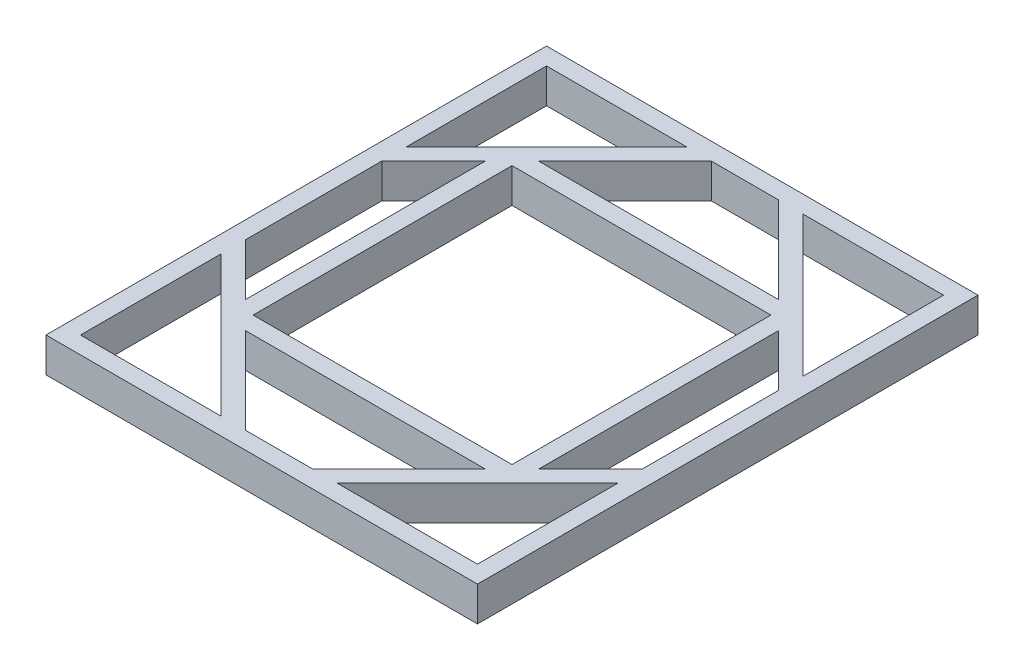
ISO-10303-21;
HEADER;
FILE_DESCRIPTION(('STEP AP214'),'2;1');
FILE_NAME('part.step','',(''),(''),'','','');
FILE_SCHEMA(('AUTOMOTIVE_DESIGN { 1 0 10303 214 1 1 1 1 }'));
ENDSEC;
DATA;
#1=APPLICATION_CONTEXT('core data for automotive mechanical design processes');
#2=APPLICATION_PROTOCOL_DEFINITION('international standard','automotive_design',2000,#1);
#3=PRODUCT_CONTEXT('',#1,'mechanical');
#4=PRODUCT('Part','Part','',(#3));
#5=PRODUCT_RELATED_PRODUCT_CATEGORY('part','',(#4));
#6=PRODUCT_DEFINITION_FORMATION('','',#4);
#7=PRODUCT_DEFINITION_CONTEXT('part definition',#1,'design');
#8=PRODUCT_DEFINITION('design','',#6,#7);
#9=PRODUCT_DEFINITION_SHAPE('','',#8);
#10=(LENGTH_UNIT() NAMED_UNIT(*) SI_UNIT(.MILLI.,.METRE.));
#11=(NAMED_UNIT(*) PLANE_ANGLE_UNIT() SI_UNIT($,.RADIAN.));
#12=(NAMED_UNIT(*) SI_UNIT($,.STERADIAN.) SOLID_ANGLE_UNIT());
#13=UNCERTAINTY_MEASURE_WITH_UNIT(LENGTH_MEASURE(1.E-05),#10,'distance_accuracy_value','');
#14=(GEOMETRIC_REPRESENTATION_CONTEXT(3) GLOBAL_UNCERTAINTY_ASSIGNED_CONTEXT((#13)) GLOBAL_UNIT_ASSIGNED_CONTEXT((#10,
#11,#12)) REPRESENTATION_CONTEXT('',''));
#15=CARTESIAN_POINT('',(0.,0.,0.));
#16=DIRECTION('',(0.,0.,1.));
#17=DIRECTION('',(1.,0.,0.));
#18=AXIS2_PLACEMENT_3D('',#15,#16,#17);
#19=CARTESIAN_POINT('',(0.,50.8,368.3));
#20=DIRECTION('',(0.,0.,-1.));
#21=DIRECTION('',(-1.,0.,0.));
#22=AXIS2_PLACEMENT_3D('',#19,#20,#21);
#23=PLANE('',#22);
#24=DIRECTION('',(1.,0.,0.));
#25=VECTOR('',#24,1.);
#26=CARTESIAN_POINT('',(0.,0.,368.3));
#27=LINE('',#26,#25);
#28=CARTESIAN_POINT('',(-317.5,0.,368.3));
#29=VERTEX_POINT('',#28);
#30=CARTESIAN_POINT('',(317.5,0.,368.3));
#31=VERTEX_POINT('',#30);
#32=EDGE_CURVE('E378',#29,#31,#27,.T.);
#33=ORIENTED_EDGE('',*,*,#32,.T.);
#34=DIRECTION('',(0.,-1.,0.));
#35=VECTOR('',#34,1.);
#36=CARTESIAN_POINT('',(317.5,50.8,368.3));
#37=LINE('',#36,#35);
#38=CARTESIAN_POINT('',(317.5,50.8,368.3));
#39=VERTEX_POINT('',#38);
#40=EDGE_CURVE('E11',#39,#31,#37,.T.);
#41=ORIENTED_EDGE('',*,*,#40,.F.);
#42=DIRECTION('',(1.,0.,0.));
#43=VECTOR('',#42,1.);
#44=CARTESIAN_POINT('',(0.,50.8,368.3));
#45=LINE('',#44,#43);
#46=CARTESIAN_POINT('',(-317.5,50.8,368.3));
#47=VERTEX_POINT('',#46);
#48=EDGE_CURVE('E290',#47,#39,#45,.T.);
#49=ORIENTED_EDGE('',*,*,#48,.F.);
#50=DIRECTION('',(0.,-1.,0.));
#51=VECTOR('',#50,1.);
#52=CARTESIAN_POINT('',(-317.5,50.8,368.3));
#53=LINE('',#52,#51);
#54=EDGE_CURVE('E61',#47,#29,#53,.T.);
#55=ORIENTED_EDGE('',*,*,#54,.T.);
#56=EDGE_LOOP('',(#33,#41,#49,#55));
#57=FACE_BOUND('',#56,.T.);
#58=ADVANCED_FACE('F42',(#57),#23,.F.);
#59=CARTESIAN_POINT('',(317.5,50.8,0.));
#60=DIRECTION('',(-1.,0.,0.));
#61=DIRECTION('',(0.,0.,1.));
#62=AXIS2_PLACEMENT_3D('',#59,#60,#61);
#63=PLANE('',#62);
#64=DIRECTION('',(0.,0.,-1.));
#65=VECTOR('',#64,1.);
#66=CARTESIAN_POINT('',(317.5,0.,0.));
#67=LINE('',#66,#65);
#68=CARTESIAN_POINT('',(317.5,0.,-368.3));
#69=VERTEX_POINT('',#68);
#70=EDGE_CURVE('E296',#31,#69,#67,.T.);
#71=ORIENTED_EDGE('',*,*,#70,.T.);
#72=DIRECTION('',(0.,-1.,0.));
#73=VECTOR('',#72,1.);
#74=CARTESIAN_POINT('',(317.5,50.8,-368.3));
#75=LINE('',#74,#73);
#76=CARTESIAN_POINT('',(317.5,50.8,-368.3));
#77=VERTEX_POINT('',#76);
#78=EDGE_CURVE('E52',#77,#69,#75,.T.);
#79=ORIENTED_EDGE('',*,*,#78,.F.);
#80=DIRECTION('',(0.,0.,-1.));
#81=VECTOR('',#80,1.);
#82=CARTESIAN_POINT('',(317.5,50.8,0.));
#83=LINE('',#82,#81);
#84=EDGE_CURVE('E284',#39,#77,#83,.T.);
#85=ORIENTED_EDGE('',*,*,#84,.F.);
#86=ORIENTED_EDGE('',*,*,#40,.T.);
#87=EDGE_LOOP('',(#71,#79,#85,#86));
#88=FACE_BOUND('',#87,.T.);
#89=ADVANCED_FACE('F295',(#88),#63,.F.);
#90=CARTESIAN_POINT('',(0.,50.8,-368.3));
#91=DIRECTION('',(0.,0.,-1.));
#92=DIRECTION('',(-1.,0.,0.));
#93=AXIS2_PLACEMENT_3D('',#90,#91,#92);
#94=PLANE('',#93);
#95=DIRECTION('',(1.,0.,0.));
#96=VECTOR('',#95,1.);
#97=CARTESIAN_POINT('',(0.,0.,-368.3));
#98=LINE('',#97,#96);
#99=CARTESIAN_POINT('',(-317.5,0.,-368.3));
#100=VERTEX_POINT('',#99);
#101=EDGE_CURVE('E381',#100,#69,#98,.T.);
#102=ORIENTED_EDGE('',*,*,#101,.F.);
#103=DIRECTION('',(0.,-1.,0.));
#104=VECTOR('',#103,1.);
#105=CARTESIAN_POINT('',(-317.5,50.8,-368.3));
#106=LINE('',#105,#104);
#107=CARTESIAN_POINT('',(-317.5,50.8,-368.3));
#108=VERTEX_POINT('',#107);
#109=EDGE_CURVE('E171',#108,#100,#106,.T.);
#110=ORIENTED_EDGE('',*,*,#109,.F.);
#111=DIRECTION('',(1.,0.,0.));
#112=VECTOR('',#111,1.);
#113=CARTESIAN_POINT('',(0.,50.8,-368.3));
#114=LINE('',#113,#112);
#115=EDGE_CURVE('E289',#108,#77,#114,.T.);
#116=ORIENTED_EDGE('',*,*,#115,.T.);
#117=ORIENTED_EDGE('',*,*,#78,.T.);
#118=EDGE_LOOP('',(#102,#110,#116,#117));
#119=FACE_BOUND('',#118,.T.);
#120=ADVANCED_FACE('F300',(#119),#94,.T.);
#121=CARTESIAN_POINT('',(-292.1,50.8,0.));
#122=DIRECTION('',(-1.,0.,0.));
#123=DIRECTION('',(0.,0.,1.));
#124=AXIS2_PLACEMENT_3D('',#121,#122,#123);
#125=PLANE('',#124);
#126=DIRECTION('',(0.,0.,-1.));
#127=VECTOR('',#126,1.);
#128=CARTESIAN_POINT('',(-292.1,0.,0.));
#129=LINE('',#128,#127);
#130=CARTESIAN_POINT('',(-292.1,0.,342.9));
#131=VERTEX_POINT('',#130);
#132=CARTESIAN_POINT('',(-292.1,0.,136.35410921541));
#133=VERTEX_POINT('',#132);
#134=EDGE_CURVE('E364',#131,#133,#129,.T.);
#135=ORIENTED_EDGE('',*,*,#134,.T.);
#136=DIRECTION('',(0.,-1.,0.));
#137=VECTOR('',#136,1.);
#138=CARTESIAN_POINT('',(-292.1,50.8,136.35410921541));
#139=LINE('',#138,#137);
#140=CARTESIAN_POINT('',(-292.1,50.8,136.35410921541));
#141=VERTEX_POINT('',#140);
#142=EDGE_CURVE('E388',#141,#133,#139,.T.);
#143=ORIENTED_EDGE('',*,*,#142,.F.);
#144=DIRECTION('',(0.,0.,-1.));
#145=VECTOR('',#144,1.);
#146=CARTESIAN_POINT('',(-292.1,50.8,0.));
#147=LINE('',#146,#145);
#148=CARTESIAN_POINT('',(-292.1,50.8,342.9));
#149=VERTEX_POINT('',#148);
#150=EDGE_CURVE('E663',#149,#141,#147,.T.);
#151=ORIENTED_EDGE('',*,*,#150,.F.);
#152=DIRECTION('',(0.,-1.,0.));
#153=VECTOR('',#152,1.);
#154=CARTESIAN_POINT('',(-292.1,50.8,342.9));
#155=LINE('',#154,#153);
#156=EDGE_CURVE('E390',#149,#131,#155,.T.);
#157=ORIENTED_EDGE('',*,*,#156,.T.);
#158=EDGE_LOOP('',(#135,#143,#151,#157));
#159=FACE_BOUND('',#158,.T.);
#160=ADVANCED_FACE('F499',(#159),#125,.F.);
#161=CARTESIAN_POINT('',(-214.227054607704,50.8,214.227054607705));
#162=DIRECTION('',(0.707106781186546,0.,-0.707106781186549));
#163=DIRECTION('',(-0.707106781186549,0.,-0.707106781186546));
#164=AXIS2_PLACEMENT_3D('',#161,#162,#163);
#165=PLANE('',#164);
#166=DIRECTION('',(0.707106781186549,0.,0.707106781186546));
#167=VECTOR('',#166,1.);
#168=CARTESIAN_POINT('',(-214.227054607704,0.,214.227054607705));
#169=LINE('',#168,#167);
#170=CARTESIAN_POINT('',(-85.5541092154091,0.,342.9));
#171=VERTEX_POINT('',#170);
#172=EDGE_CURVE('E375',#133,#171,#169,.T.);
#173=ORIENTED_EDGE('',*,*,#172,.T.);
#174=DIRECTION('',(0.,-1.,0.));
#175=VECTOR('',#174,1.);
#176=CARTESIAN_POINT('',(-85.5541092154091,50.8,342.9));
#177=LINE('',#176,#175);
#178=CARTESIAN_POINT('',(-85.5541092154091,50.8,342.9));
#179=VERTEX_POINT('',#178);
#180=EDGE_CURVE('E392',#179,#171,#177,.T.);
#181=ORIENTED_EDGE('',*,*,#180,.F.);
#182=DIRECTION('',(0.707106781186549,0.,0.707106781186546));
#183=VECTOR('',#182,1.);
#184=CARTESIAN_POINT('',(-214.227054607704,50.8,214.227054607705));
#185=LINE('',#184,#183);
#186=EDGE_CURVE('E674',#141,#179,#185,.T.);
#187=ORIENTED_EDGE('',*,*,#186,.F.);
#188=ORIENTED_EDGE('',*,*,#142,.T.);
#189=EDGE_LOOP('',(#173,#181,#187,#188));
#190=FACE_BOUND('',#189,.T.);
#191=ADVANCED_FACE('F495',(#190),#165,.F.);
#192=CARTESIAN_POINT('',(-292.1,0.,100.433084731133));
#193=VERTEX_POINT('',#192);
#194=CARTESIAN_POINT('',(-292.1,0.,-100.433084731133));
#195=VERTEX_POINT('',#194);
#196=EDGE_CURVE('E365',#193,#195,#129,.T.);
#197=ORIENTED_EDGE('',*,*,#196,.T.);
#198=DIRECTION('',(0.,-1.,0.));
#199=VECTOR('',#198,1.);
#200=CARTESIAN_POINT('',(-292.1,50.8,-100.433084731133));
#201=LINE('',#200,#199);
#202=CARTESIAN_POINT('',(-292.1,50.8,-100.433084731133));
#203=VERTEX_POINT('',#202);
#204=EDGE_CURVE('E393',#203,#195,#201,.T.);
#205=ORIENTED_EDGE('',*,*,#204,.F.);
#206=CARTESIAN_POINT('',(-292.1,50.8,100.433084731133));
#207=VERTEX_POINT('',#206);
#208=EDGE_CURVE('E664',#207,#203,#147,.T.);
#209=ORIENTED_EDGE('',*,*,#208,.F.);
#210=DIRECTION('',(0.,-1.,0.));
#211=VECTOR('',#210,1.);
#212=CARTESIAN_POINT('',(-292.1,50.8,100.433084731133));
#213=LINE('',#212,#211);
#214=EDGE_CURVE('E397',#207,#193,#213,.T.);
#215=ORIENTED_EDGE('',*,*,#214,.T.);
#216=EDGE_LOOP('',(#197,#205,#209,#215));
#217=FACE_BOUND('',#216,.T.);
#218=ADVANCED_FACE('F498',(#217),#125,.F.);
#219=CARTESIAN_POINT('',(-196.266542365566,50.8,-196.266542365567));
#220=DIRECTION('',(-0.707106781186546,0.,-0.707106781186549));
#221=DIRECTION('',(-0.707106781186549,0.,0.707106781186546));
#222=AXIS2_PLACEMENT_3D('',#219,#220,#221);
#223=PLANE('',#222);
#224=DIRECTION('',(0.707106781186549,0.,-0.707106781186546));
#225=VECTOR('',#224,1.);
#226=CARTESIAN_POINT('',(-196.266542365566,0.,-196.266542365567));
#227=LINE('',#226,#225);
#228=CARTESIAN_POINT('',(-215.9,0.,-176.633084731133));
#229=VERTEX_POINT('',#228);
#230=EDGE_CURVE('E330',#195,#229,#227,.T.);
#231=ORIENTED_EDGE('',*,*,#230,.T.);
#232=DIRECTION('',(0.,-1.,0.));
#233=VECTOR('',#232,1.);
#234=CARTESIAN_POINT('',(-215.9,50.8,-176.633084731133));
#235=LINE('',#234,#233);
#236=CARTESIAN_POINT('',(-215.9,50.8,-176.633084731133));
#237=VERTEX_POINT('',#236);
#238=EDGE_CURVE('E402',#237,#229,#235,.T.);
#239=ORIENTED_EDGE('',*,*,#238,.F.);
#240=DIRECTION('',(0.707106781186549,0.,-0.707106781186546));
#241=VECTOR('',#240,1.);
#242=CARTESIAN_POINT('',(-196.266542365566,50.8,-196.266542365567));
#243=LINE('',#242,#241);
#244=EDGE_CURVE('E673',#203,#237,#243,.T.);
#245=ORIENTED_EDGE('',*,*,#244,.F.);
#246=ORIENTED_EDGE('',*,*,#204,.T.);
#247=EDGE_LOOP('',(#231,#239,#245,#246));
#248=FACE_BOUND('',#247,.T.);
#249=ADVANCED_FACE('F514',(#248),#223,.F.);
#250=CARTESIAN_POINT('',(-215.9,50.8,0.));
#251=DIRECTION('',(1.,0.,0.));
#252=DIRECTION('',(0.,0.,-1.));
#253=AXIS2_PLACEMENT_3D('',#250,#251,#252);
#254=PLANE('',#253);
#255=DIRECTION('',(0.,0.,1.));
#256=VECTOR('',#255,1.);
#257=CARTESIAN_POINT('',(-215.9,0.,0.));
#258=LINE('',#257,#256);
#259=CARTESIAN_POINT('',(-215.9,0.,176.633084731133));
#260=VERTEX_POINT('',#259);
#261=EDGE_CURVE('E372',#229,#260,#258,.T.);
#262=ORIENTED_EDGE('',*,*,#261,.T.);
#263=DIRECTION('',(0.,-1.,0.));
#264=VECTOR('',#263,1.);
#265=CARTESIAN_POINT('',(-215.9,50.8,176.633084731133));
#266=LINE('',#265,#264);
#267=CARTESIAN_POINT('',(-215.9,50.8,176.633084731133));
#268=VERTEX_POINT('',#267);
#269=EDGE_CURVE('E399',#268,#260,#266,.T.);
#270=ORIENTED_EDGE('',*,*,#269,.F.);
#271=DIRECTION('',(0.,0.,1.));
#272=VECTOR('',#271,1.);
#273=CARTESIAN_POINT('',(-215.9,50.8,0.));
#274=LINE('',#273,#272);
#275=EDGE_CURVE('E671',#237,#268,#274,.T.);
#276=ORIENTED_EDGE('',*,*,#275,.F.);
#277=ORIENTED_EDGE('',*,*,#238,.T.);
#278=EDGE_LOOP('',(#262,#270,#276,#277));
#279=FACE_BOUND('',#278,.T.);
#280=ADVANCED_FACE('F510',(#279),#254,.F.);
#281=CARTESIAN_POINT('',(196.266542365566,50.8,196.266542365567));
#282=DIRECTION('',(0.707106781186546,0.,0.707106781186549));
#283=DIRECTION('',(0.707106781186549,0.,-0.707106781186546));
#284=AXIS2_PLACEMENT_3D('',#281,#282,#283);
#285=PLANE('',#284);
#286=DIRECTION('',(-0.707106781186549,0.,0.707106781186546));
#287=VECTOR('',#286,1.);
#288=CARTESIAN_POINT('',(196.266542365566,0.,196.266542365567));
#289=LINE('',#288,#287);
#290=CARTESIAN_POINT('',(176.656999999999,0.,215.876084731133));
#291=VERTEX_POINT('',#290);
#292=CARTESIAN_POINT('',(49.6330847311324,0.,342.9));
#293=VERTEX_POINT('',#292);
#294=EDGE_CURVE('E346',#291,#293,#289,.T.);
#295=ORIENTED_EDGE('',*,*,#294,.T.);
#296=DIRECTION('',(0.,-1.,0.));
#297=VECTOR('',#296,1.);
#298=CARTESIAN_POINT('',(49.6330847311324,50.8,342.9));
#299=LINE('',#298,#297);
#300=CARTESIAN_POINT('',(49.6330847311324,50.8,342.9));
#301=VERTEX_POINT('',#300);
#302=EDGE_CURVE('E400',#301,#293,#299,.T.);
#303=ORIENTED_EDGE('',*,*,#302,.F.);
#304=DIRECTION('',(-0.707106781186549,0.,0.707106781186546));
#305=VECTOR('',#304,1.);
#306=CARTESIAN_POINT('',(196.266542365566,50.8,196.266542365567));
#307=LINE('',#306,#305);
#308=CARTESIAN_POINT('',(176.656999999999,50.8,215.876084731133));
#309=VERTEX_POINT('',#308);
#310=EDGE_CURVE('E626',#309,#301,#307,.T.);
#311=ORIENTED_EDGE('',*,*,#310,.F.);
#312=DIRECTION('',(0.,-1.,0.));
#313=VECTOR('',#312,1.);
#314=CARTESIAN_POINT('',(176.656999999999,50.8,215.876084731133));
#315=LINE('',#314,#313);
#316=EDGE_CURVE('E407',#309,#291,#315,.T.);
#317=ORIENTED_EDGE('',*,*,#316,.T.);
#318=EDGE_LOOP('',(#295,#303,#311,#317));
#319=FACE_BOUND('',#318,.T.);
#320=ADVANCED_FACE('F513',(#319),#285,.F.);
#321=CARTESIAN_POINT('',(0.,50.8,342.9));
#322=DIRECTION('',(0.,0.,-1.));
#323=DIRECTION('',(-1.,0.,0.));
#324=AXIS2_PLACEMENT_3D('',#321,#322,#323);
#325=PLANE('',#324);
#326=DIRECTION('',(1.,0.,0.));
#327=VECTOR('',#326,1.);
#328=CARTESIAN_POINT('',(0.,0.,342.9));
#329=LINE('',#328,#327);
#330=CARTESIAN_POINT('',(-49.6330847311324,0.,342.9));
#331=VERTEX_POINT('',#330);
#332=EDGE_CURVE('E355',#331,#293,#329,.T.);
#333=ORIENTED_EDGE('',*,*,#332,.F.);
#334=DIRECTION('',(0.,-1.,0.));
#335=VECTOR('',#334,1.);
#336=CARTESIAN_POINT('',(-49.6330847311324,50.8,342.9));
#337=LINE('',#336,#335);
#338=CARTESIAN_POINT('',(-49.6330847311324,50.8,342.9));
#339=VERTEX_POINT('',#338);
#340=EDGE_CURVE('E413',#339,#331,#337,.T.);
#341=ORIENTED_EDGE('',*,*,#340,.F.);
#342=DIRECTION('',(1.,0.,0.));
#343=VECTOR('',#342,1.);
#344=CARTESIAN_POINT('',(0.,50.8,342.9));
#345=LINE('',#344,#343);
#346=EDGE_CURVE('E608',#339,#301,#345,.T.);
#347=ORIENTED_EDGE('',*,*,#346,.T.);
#348=ORIENTED_EDGE('',*,*,#302,.T.);
#349=EDGE_LOOP('',(#333,#341,#347,#348));
#350=FACE_BOUND('',#349,.T.);
#351=ADVANCED_FACE('F485',(#350),#325,.T.);
#352=CARTESIAN_POINT('',(-196.266542365566,50.8,196.266542365567));
#353=DIRECTION('',(0.707106781186546,0.,-0.707106781186549));
#354=DIRECTION('',(-0.707106781186549,0.,-0.707106781186546));
#355=AXIS2_PLACEMENT_3D('',#352,#353,#354);
#356=PLANE('',#355);
#357=DIRECTION('',(0.707106781186549,0.,0.707106781186546));
#358=VECTOR('',#357,1.);
#359=CARTESIAN_POINT('',(-196.266542365566,0.,196.266542365567));
#360=LINE('',#359,#358);
#361=CARTESIAN_POINT('',(-176.656999999999,0.,215.876084731133));
#362=VERTEX_POINT('',#361);
#363=EDGE_CURVE('E366',#362,#331,#360,.T.);
#364=ORIENTED_EDGE('',*,*,#363,.F.);
#365=DIRECTION('',(0.,-1.,0.));
#366=VECTOR('',#365,1.);
#367=CARTESIAN_POINT('',(-176.656999999999,50.8,215.876084731133));
#368=LINE('',#367,#366);
#369=CARTESIAN_POINT('',(-176.656999999999,50.8,215.876084731133));
#370=VERTEX_POINT('',#369);
#371=EDGE_CURVE('E410',#370,#362,#368,.T.);
#372=ORIENTED_EDGE('',*,*,#371,.F.);
#373=DIRECTION('',(0.707106781186549,0.,0.707106781186546));
#374=VECTOR('',#373,1.);
#375=CARTESIAN_POINT('',(-196.266542365566,50.8,196.266542365567));
#376=LINE('',#375,#374);
#377=EDGE_CURVE('E665',#370,#339,#376,.T.);
#378=ORIENTED_EDGE('',*,*,#377,.T.);
#379=ORIENTED_EDGE('',*,*,#340,.T.);
#380=EDGE_LOOP('',(#364,#372,#378,#379));
#381=FACE_BOUND('',#380,.T.);
#382=ADVANCED_FACE('F509',(#381),#356,.T.);
#383=CARTESIAN_POINT('',(-214.227054607704,50.8,-214.227054607705));
#384=DIRECTION('',(-0.707106781186546,0.,-0.707106781186549));
#385=DIRECTION('',(-0.707106781186549,0.,0.707106781186546));
#386=AXIS2_PLACEMENT_3D('',#383,#384,#385);
#387=PLANE('',#386);
#388=DIRECTION('',(0.707106781186549,0.,-0.707106781186546));
#389=VECTOR('',#388,1.);
#390=CARTESIAN_POINT('',(-214.227054607704,0.,-214.227054607705));
#391=LINE('',#390,#389);
#392=CARTESIAN_POINT('',(-292.1,0.,-136.35410921541));
#393=VERTEX_POINT('',#392);
#394=CARTESIAN_POINT('',(-85.5541092154092,0.,-342.9));
#395=VERTEX_POINT('',#394);
#396=EDGE_CURVE('E358',#393,#395,#391,.T.);
#397=ORIENTED_EDGE('',*,*,#396,.F.);
#398=DIRECTION('',(0.,-1.,0.));
#399=VECTOR('',#398,1.);
#400=CARTESIAN_POINT('',(-292.1,50.8,-136.35410921541));
#401=LINE('',#400,#399);
#402=CARTESIAN_POINT('',(-292.1,50.8,-136.35410921541));
#403=VERTEX_POINT('',#402);
#404=EDGE_CURVE('E411',#403,#393,#401,.T.);
#405=ORIENTED_EDGE('',*,*,#404,.F.);
#406=DIRECTION('',(0.707106781186549,0.,-0.707106781186546));
#407=VECTOR('',#406,1.);
#408=CARTESIAN_POINT('',(-214.227054607704,50.8,-214.227054607705));
#409=LINE('',#408,#407);
#410=CARTESIAN_POINT('',(-85.5541092154092,50.8,-342.9));
#411=VERTEX_POINT('',#410);
#412=EDGE_CURVE('E610',#403,#411,#409,.T.);
#413=ORIENTED_EDGE('',*,*,#412,.T.);
#414=DIRECTION('',(0.,-1.,0.));
#415=VECTOR('',#414,1.);
#416=CARTESIAN_POINT('',(-85.5541092154092,50.8,-342.9));
#417=LINE('',#416,#415);
#418=EDGE_CURVE('E416',#411,#395,#417,.T.);
#419=ORIENTED_EDGE('',*,*,#418,.T.);
#420=EDGE_LOOP('',(#397,#405,#413,#419));
#421=FACE_BOUND('',#420,.T.);
#422=ADVANCED_FACE('F534',(#421),#387,.T.);
#423=CARTESIAN_POINT('',(-292.1,0.,-342.9));
#424=VERTEX_POINT('',#423);
#425=EDGE_CURVE('E361',#393,#424,#129,.T.);
#426=ORIENTED_EDGE('',*,*,#425,.T.);
#427=DIRECTION('',(0.,-1.,0.));
#428=VECTOR('',#427,1.);
#429=CARTESIAN_POINT('',(-292.1,50.8,-342.9));
#430=LINE('',#429,#428);
#431=CARTESIAN_POINT('',(-292.1,50.8,-342.9));
#432=VERTEX_POINT('',#431);
#433=EDGE_CURVE('E418',#432,#424,#430,.T.);
#434=ORIENTED_EDGE('',*,*,#433,.F.);
#435=EDGE_CURVE('E615',#403,#432,#147,.T.);
#436=ORIENTED_EDGE('',*,*,#435,.F.);
#437=ORIENTED_EDGE('',*,*,#404,.T.);
#438=EDGE_LOOP('',(#426,#434,#436,#437));
#439=FACE_BOUND('',#438,.T.);
#440=ADVANCED_FACE('F504',(#439),#125,.F.);
#441=CARTESIAN_POINT('',(85.5541092154091,0.,342.9));
#442=VERTEX_POINT('',#441);
#443=CARTESIAN_POINT('',(292.1,0.,342.9));
#444=VERTEX_POINT('',#443);
#445=EDGE_CURVE('E350',#442,#444,#329,.T.);
#446=ORIENTED_EDGE('',*,*,#445,.F.);
#447=DIRECTION('',(0.,-1.,0.));
#448=VECTOR('',#447,1.);
#449=CARTESIAN_POINT('',(85.5541092154091,50.8,342.9));
#450=LINE('',#449,#448);
#451=CARTESIAN_POINT('',(85.5541092154091,50.8,342.9));
#452=VERTEX_POINT('',#451);
#453=EDGE_CURVE('E419',#452,#442,#450,.T.);
#454=ORIENTED_EDGE('',*,*,#453,.F.);
#455=CARTESIAN_POINT('',(292.1,50.8,342.9));
#456=VERTEX_POINT('',#455);
#457=EDGE_CURVE('E603',#452,#456,#345,.T.);
#458=ORIENTED_EDGE('',*,*,#457,.T.);
#459=DIRECTION('',(0.,-1.,0.));
#460=VECTOR('',#459,1.);
#461=CARTESIAN_POINT('',(292.1,50.8,342.9));
#462=LINE('',#461,#460);
#463=EDGE_CURVE('E423',#456,#444,#462,.T.);
#464=ORIENTED_EDGE('',*,*,#463,.T.);
#465=EDGE_LOOP('',(#446,#454,#458,#464));
#466=FACE_BOUND('',#465,.T.);
#467=ADVANCED_FACE('F484',(#466),#325,.T.);
#468=CARTESIAN_POINT('',(214.227054607704,50.8,214.227054607705));
#469=DIRECTION('',(0.707106781186546,0.,0.707106781186549));
#470=DIRECTION('',(0.707106781186549,0.,-0.707106781186546));
#471=AXIS2_PLACEMENT_3D('',#468,#469,#470);
#472=PLANE('',#471);
#473=DIRECTION('',(-0.707106781186549,0.,0.707106781186546));
#474=VECTOR('',#473,1.);
#475=CARTESIAN_POINT('',(214.227054607704,0.,214.227054607705));
#476=LINE('',#475,#474);
#477=CARTESIAN_POINT('',(292.1,0.,136.35410921541));
#478=VERTEX_POINT('',#477);
#479=EDGE_CURVE('E353',#478,#442,#476,.T.);
#480=ORIENTED_EDGE('',*,*,#479,.F.);
#481=DIRECTION('',(0.,-1.,0.));
#482=VECTOR('',#481,1.);
#483=CARTESIAN_POINT('',(292.1,50.8,136.35410921541));
#484=LINE('',#483,#482);
#485=CARTESIAN_POINT('',(292.1,50.8,136.35410921541));
#486=VERTEX_POINT('',#485);
#487=EDGE_CURVE('E425',#486,#478,#484,.T.);
#488=ORIENTED_EDGE('',*,*,#487,.F.);
#489=DIRECTION('',(-0.707106781186549,0.,0.707106781186546));
#490=VECTOR('',#489,1.);
#491=CARTESIAN_POINT('',(214.227054607704,50.8,214.227054607705));
#492=LINE('',#491,#490);
#493=EDGE_CURVE('E600',#486,#452,#492,.T.);
#494=ORIENTED_EDGE('',*,*,#493,.T.);
#495=ORIENTED_EDGE('',*,*,#453,.T.);
#496=EDGE_LOOP('',(#480,#488,#494,#495));
#497=FACE_BOUND('',#496,.T.);
#498=ADVANCED_FACE('F543',(#497),#472,.T.);
#499=CARTESIAN_POINT('',(292.1,50.8,0.));
#500=DIRECTION('',(-1.,0.,0.));
#501=DIRECTION('',(0.,0.,1.));
#502=AXIS2_PLACEMENT_3D('',#499,#500,#501);
#503=PLANE('',#502);
#504=DIRECTION('',(0.,0.,-1.));
#505=VECTOR('',#504,1.);
#506=CARTESIAN_POINT('',(292.1,0.,0.));
#507=LINE('',#506,#505);
#508=CARTESIAN_POINT('',(292.1,0.,-136.35410921541));
#509=VERTEX_POINT('',#508);
#510=CARTESIAN_POINT('',(292.1,0.,-342.9));
#511=VERTEX_POINT('',#510);
#512=EDGE_CURVE('E343',#509,#511,#507,.T.);
#513=ORIENTED_EDGE('',*,*,#512,.F.);
#514=DIRECTION('',(0.,-1.,0.));
#515=VECTOR('',#514,1.);
#516=CARTESIAN_POINT('',(292.1,50.8,-136.35410921541));
#517=LINE('',#516,#515);
#518=CARTESIAN_POINT('',(292.1,50.8,-136.35410921541));
#519=VERTEX_POINT('',#518);
#520=EDGE_CURVE('E426',#519,#509,#517,.T.);
#521=ORIENTED_EDGE('',*,*,#520,.F.);
#522=DIRECTION('',(0.,0.,-1.));
#523=VECTOR('',#522,1.);
#524=CARTESIAN_POINT('',(292.1,50.8,0.));
#525=LINE('',#524,#523);
#526=CARTESIAN_POINT('',(292.1,50.8,-342.9));
#527=VERTEX_POINT('',#526);
#528=EDGE_CURVE('E612',#519,#527,#525,.T.);
#529=ORIENTED_EDGE('',*,*,#528,.T.);
#530=DIRECTION('',(0.,-1.,0.));
#531=VECTOR('',#530,1.);
#532=CARTESIAN_POINT('',(292.1,50.8,-342.9));
#533=LINE('',#532,#531);
#534=EDGE_CURVE('E429',#527,#511,#533,.T.);
#535=ORIENTED_EDGE('',*,*,#534,.T.);
#536=EDGE_LOOP('',(#513,#521,#529,#535));
#537=FACE_BOUND('',#536,.T.);
#538=ADVANCED_FACE('F542',(#537),#503,.T.);
#539=CARTESIAN_POINT('',(214.227054607704,50.8,-214.227054607705));
#540=DIRECTION('',(-0.707106781186546,0.,0.707106781186549));
#541=DIRECTION('',(0.707106781186549,0.,0.707106781186546));
#542=AXIS2_PLACEMENT_3D('',#539,#540,#541);
#543=PLANE('',#542);
#544=DIRECTION('',(-0.707106781186549,0.,-0.707106781186546));
#545=VECTOR('',#544,1.);
#546=CARTESIAN_POINT('',(214.227054607704,0.,-214.227054607705));
#547=LINE('',#546,#545);
#548=CARTESIAN_POINT('',(85.5541092154093,0.,-342.9));
#549=VERTEX_POINT('',#548);
#550=EDGE_CURVE('E347',#509,#549,#547,.T.);
#551=ORIENTED_EDGE('',*,*,#550,.T.);
#552=DIRECTION('',(0.,-1.,0.));
#553=VECTOR('',#552,1.);
#554=CARTESIAN_POINT('',(85.5541092154093,50.8,-342.9));
#555=LINE('',#554,#553);
#556=CARTESIAN_POINT('',(85.5541092154093,50.8,-342.9));
#557=VERTEX_POINT('',#556);
#558=EDGE_CURVE('E431',#557,#549,#555,.T.);
#559=ORIENTED_EDGE('',*,*,#558,.F.);
#560=DIRECTION('',(-0.707106781186549,0.,-0.707106781186546));
#561=VECTOR('',#560,1.);
#562=CARTESIAN_POINT('',(214.227054607704,50.8,-214.227054607705));
#563=LINE('',#562,#561);
#564=EDGE_CURVE('E620',#519,#557,#563,.T.);
#565=ORIENTED_EDGE('',*,*,#564,.F.);
#566=ORIENTED_EDGE('',*,*,#520,.T.);
#567=EDGE_LOOP('',(#551,#559,#565,#566));
#568=FACE_BOUND('',#567,.T.);
#569=ADVANCED_FACE('F547',(#568),#543,.F.);
#570=CARTESIAN_POINT('',(215.9,50.8,0.));
#571=DIRECTION('',(1.,0.,0.));
#572=DIRECTION('',(0.,0.,-1.));
#573=AXIS2_PLACEMENT_3D('',#570,#571,#572);
#574=PLANE('',#573);
#575=DIRECTION('',(0.,0.,1.));
#576=VECTOR('',#575,1.);
#577=CARTESIAN_POINT('',(215.9,0.,0.));
#578=LINE('',#577,#576);
#579=CARTESIAN_POINT('',(215.9,0.,-176.633084731133));
#580=VERTEX_POINT('',#579);
#581=CARTESIAN_POINT('',(215.9,0.,176.633084731133));
#582=VERTEX_POINT('',#581);
#583=EDGE_CURVE('E333',#580,#582,#578,.T.);
#584=ORIENTED_EDGE('',*,*,#583,.F.);
#585=DIRECTION('',(0.,-1.,0.));
#586=VECTOR('',#585,1.);
#587=CARTESIAN_POINT('',(215.9,50.8,-176.633084731133));
#588=LINE('',#587,#586);
#589=CARTESIAN_POINT('',(215.9,50.8,-176.633084731133));
#590=VERTEX_POINT('',#589);
#591=EDGE_CURVE('E432',#590,#580,#588,.T.);
#592=ORIENTED_EDGE('',*,*,#591,.F.);
#593=DIRECTION('',(0.,0.,1.));
#594=VECTOR('',#593,1.);
#595=CARTESIAN_POINT('',(215.9,50.8,0.));
#596=LINE('',#595,#594);
#597=CARTESIAN_POINT('',(215.9,50.8,176.633084731133));
#598=VERTEX_POINT('',#597);
#599=EDGE_CURVE('E628',#590,#598,#596,.T.);
#600=ORIENTED_EDGE('',*,*,#599,.T.);
#601=DIRECTION('',(0.,-1.,0.));
#602=VECTOR('',#601,1.);
#603=CARTESIAN_POINT('',(215.9,50.8,176.633084731133));
#604=LINE('',#603,#602);
#605=EDGE_CURVE('E436',#598,#582,#604,.T.);
#606=ORIENTED_EDGE('',*,*,#605,.T.);
#607=EDGE_LOOP('',(#584,#592,#600,#606));
#608=FACE_BOUND('',#607,.T.);
#609=ADVANCED_FACE('F550',(#608),#574,.T.);
#610=CARTESIAN_POINT('',(196.266542365566,50.8,-196.266542365567));
#611=DIRECTION('',(-0.707106781186546,0.,0.707106781186549));
#612=DIRECTION('',(0.707106781186549,0.,0.707106781186546));
#613=AXIS2_PLACEMENT_3D('',#610,#611,#612);
#614=PLANE('',#613);
#615=DIRECTION('',(-0.707106781186549,0.,-0.707106781186546));
#616=VECTOR('',#615,1.);
#617=CARTESIAN_POINT('',(196.266542365566,0.,-196.266542365567));
#618=LINE('',#617,#616);
#619=CARTESIAN_POINT('',(292.1,0.,-100.433084731133));
#620=VERTEX_POINT('',#619);
#621=EDGE_CURVE('E323',#620,#580,#618,.T.);
#622=ORIENTED_EDGE('',*,*,#621,.F.);
#623=DIRECTION('',(0.,-1.,0.));
#624=VECTOR('',#623,1.);
#625=CARTESIAN_POINT('',(292.1,50.8,-100.433084731133));
#626=LINE('',#625,#624);
#627=CARTESIAN_POINT('',(292.1,50.8,-100.433084731133));
#628=VERTEX_POINT('',#627);
#629=EDGE_CURVE('E441',#628,#620,#626,.T.);
#630=ORIENTED_EDGE('',*,*,#629,.F.);
#631=DIRECTION('',(-0.707106781186549,0.,-0.707106781186546));
#632=VECTOR('',#631,1.);
#633=CARTESIAN_POINT('',(196.266542365566,50.8,-196.266542365567));
#634=LINE('',#633,#632);
#635=EDGE_CURVE('E623',#628,#590,#634,.T.);
#636=ORIENTED_EDGE('',*,*,#635,.T.);
#637=ORIENTED_EDGE('',*,*,#591,.T.);
#638=EDGE_LOOP('',(#622,#630,#636,#637));
#639=FACE_BOUND('',#638,.T.);
#640=ADVANCED_FACE('F552',(#639),#614,.T.);
#641=CARTESIAN_POINT('',(292.1,0.,100.433084731133));
#642=VERTEX_POINT('',#641);
#643=EDGE_CURVE('E338',#642,#620,#507,.T.);
#644=ORIENTED_EDGE('',*,*,#643,.F.);
#645=DIRECTION('',(0.,-1.,0.));
#646=VECTOR('',#645,1.);
#647=CARTESIAN_POINT('',(292.1,50.8,100.433084731133));
#648=LINE('',#647,#646);
#649=CARTESIAN_POINT('',(292.1,50.8,100.433084731133));
#650=VERTEX_POINT('',#649);
#651=EDGE_CURVE('E438',#650,#642,#648,.T.);
#652=ORIENTED_EDGE('',*,*,#651,.F.);
#653=EDGE_CURVE('E613',#650,#628,#525,.T.);
#654=ORIENTED_EDGE('',*,*,#653,.T.);
#655=ORIENTED_EDGE('',*,*,#629,.T.);
#656=EDGE_LOOP('',(#644,#652,#654,#655));
#657=FACE_BOUND('',#656,.T.);
#658=ADVANCED_FACE('F541',(#657),#503,.T.);
#659=CARTESIAN_POINT('',(176.657,0.,-215.876084731133));
#660=VERTEX_POINT('',#659);
#661=CARTESIAN_POINT('',(49.6330847311326,0.,-342.9));
#662=VERTEX_POINT('',#661);
#663=EDGE_CURVE('E319',#660,#662,#618,.T.);
#664=ORIENTED_EDGE('',*,*,#663,.F.);
#665=DIRECTION('',(0.,-1.,0.));
#666=VECTOR('',#665,1.);
#667=CARTESIAN_POINT('',(176.657,50.8,-215.876084731133));
#668=LINE('',#667,#666);
#669=CARTESIAN_POINT('',(176.657,50.8,-215.876084731133));
#670=VERTEX_POINT('',#669);
#671=EDGE_CURVE('E439',#670,#660,#668,.T.);
#672=ORIENTED_EDGE('',*,*,#671,.F.);
#673=CARTESIAN_POINT('',(49.6330847311326,50.8,-342.9));
#674=VERTEX_POINT('',#673);
#675=EDGE_CURVE('E630',#670,#674,#634,.T.);
#676=ORIENTED_EDGE('',*,*,#675,.T.);
#677=DIRECTION('',(0.,-1.,0.));
#678=VECTOR('',#677,1.);
#679=CARTESIAN_POINT('',(49.6330847311326,50.8,-342.9));
#680=LINE('',#679,#678);
#681=EDGE_CURVE('E444',#674,#662,#680,.T.);
#682=ORIENTED_EDGE('',*,*,#681,.T.);
#683=EDGE_LOOP('',(#664,#672,#676,#682));
#684=FACE_BOUND('',#683,.T.);
#685=ADVANCED_FACE('F556',(#684),#614,.T.);
#686=CARTESIAN_POINT('',(0.,50.8,-215.876084731133));
#687=DIRECTION('',(0.,0.,-1.));
#688=DIRECTION('',(-1.,0.,0.));
#689=AXIS2_PLACEMENT_3D('',#686,#687,#688);
#690=PLANE('',#689);
#691=DIRECTION('',(1.,0.,0.));
#692=VECTOR('',#691,1.);
#693=CARTESIAN_POINT('',(0.,0.,-215.876084731133));
#694=LINE('',#693,#692);
#695=CARTESIAN_POINT('',(-176.657,0.,-215.876084731133));
#696=VERTEX_POINT('',#695);
#697=EDGE_CURVE('E322',#696,#660,#694,.T.);
#698=ORIENTED_EDGE('',*,*,#697,.F.);
#699=DIRECTION('',(0.,-1.,0.));
#700=VECTOR('',#699,1.);
#701=CARTESIAN_POINT('',(-176.657,50.8,-215.876084731133));
#702=LINE('',#701,#700);
#703=CARTESIAN_POINT('',(-176.657,50.8,-215.876084731133));
#704=VERTEX_POINT('',#703);
#705=EDGE_CURVE('E449',#704,#696,#702,.T.);
#706=ORIENTED_EDGE('',*,*,#705,.F.);
#707=DIRECTION('',(1.,0.,0.));
#708=VECTOR('',#707,1.);
#709=CARTESIAN_POINT('',(0.,50.8,-215.876084731133));
#710=LINE('',#709,#708);
#711=EDGE_CURVE('E637',#704,#670,#710,.T.);
#712=ORIENTED_EDGE('',*,*,#711,.T.);
#713=ORIENTED_EDGE('',*,*,#671,.T.);
#714=EDGE_LOOP('',(#698,#706,#712,#713));
#715=FACE_BOUND('',#714,.T.);
#716=ADVANCED_FACE('F560',(#715),#690,.T.);
#717=CARTESIAN_POINT('',(-49.6330847311326,0.,-342.9));
#718=VERTEX_POINT('',#717);
#719=EDGE_CURVE('E326',#696,#718,#227,.T.);
#720=ORIENTED_EDGE('',*,*,#719,.T.);
#721=DIRECTION('',(0.,-1.,0.));
#722=VECTOR('',#721,1.);
#723=CARTESIAN_POINT('',(-49.6330847311326,50.8,-342.9));
#724=LINE('',#723,#722);
#725=CARTESIAN_POINT('',(-49.6330847311326,50.8,-342.9));
#726=VERTEX_POINT('',#725);
#727=EDGE_CURVE('E446',#726,#718,#724,.T.);
#728=ORIENTED_EDGE('',*,*,#727,.F.);
#729=EDGE_CURVE('E641',#704,#726,#243,.T.);
#730=ORIENTED_EDGE('',*,*,#729,.F.);
#731=ORIENTED_EDGE('',*,*,#705,.T.);
#732=EDGE_LOOP('',(#720,#728,#730,#731));
#733=FACE_BOUND('',#732,.T.);
#734=ADVANCED_FACE('F519',(#733),#223,.F.);
#735=CARTESIAN_POINT('',(0.,50.8,-190.476084731133));
#736=DIRECTION('',(0.,0.,-1.));
#737=DIRECTION('',(-1.,0.,0.));
#738=AXIS2_PLACEMENT_3D('',#735,#736,#737);
#739=PLANE('',#738);
#740=DIRECTION('',(1.,0.,0.));
#741=VECTOR('',#740,1.);
#742=CARTESIAN_POINT('',(0.,0.,-190.476084731133));
#743=LINE('',#742,#741);
#744=CARTESIAN_POINT('',(-190.5,0.,-190.476084731133));
#745=VERTEX_POINT('',#744);
#746=CARTESIAN_POINT('',(190.5,0.,-190.476084731133));
#747=VERTEX_POINT('',#746);
#748=EDGE_CURVE('E307',#745,#747,#743,.T.);
#749=ORIENTED_EDGE('',*,*,#748,.T.);
#750=DIRECTION('',(0.,-1.,0.));
#751=VECTOR('',#750,1.);
#752=CARTESIAN_POINT('',(190.5,50.8,-190.476084731133));
#753=LINE('',#752,#751);
#754=CARTESIAN_POINT('',(190.5,50.8,-190.476084731133));
#755=VERTEX_POINT('',#754);
#756=EDGE_CURVE('E46',#755,#747,#753,.T.);
#757=ORIENTED_EDGE('',*,*,#756,.F.);
#758=DIRECTION('',(1.,0.,0.));
#759=VECTOR('',#758,1.);
#760=CARTESIAN_POINT('',(0.,50.8,-190.476084731133));
#761=LINE('',#760,#759);
#762=CARTESIAN_POINT('',(-190.5,50.8,-190.476084731133));
#763=VERTEX_POINT('',#762);
#764=EDGE_CURVE('E386',#763,#755,#761,.T.);
#765=ORIENTED_EDGE('',*,*,#764,.F.);
#766=DIRECTION('',(0.,-1.,0.));
#767=VECTOR('',#766,1.);
#768=CARTESIAN_POINT('',(-190.5,50.8,-190.476084731133));
#769=LINE('',#768,#767);
#770=EDGE_CURVE('E303',#763,#745,#769,.T.);
#771=ORIENTED_EDGE('',*,*,#770,.T.);
#772=EDGE_LOOP('',(#749,#757,#765,#771));
#773=FACE_BOUND('',#772,.T.);
#774=ADVANCED_FACE('F44',(#773),#739,.F.);
#775=CARTESIAN_POINT('',(190.5,50.8,0.));
#776=DIRECTION('',(1.,0.,0.));
#777=DIRECTION('',(0.,0.,-1.));
#778=AXIS2_PLACEMENT_3D('',#775,#776,#777);
#779=PLANE('',#778);
#780=DIRECTION('',(0.,0.,1.));
#781=VECTOR('',#780,1.);
#782=CARTESIAN_POINT('',(190.5,0.,0.));
#783=LINE('',#782,#781);
#784=CARTESIAN_POINT('',(190.5,0.,190.476084731133));
#785=VERTEX_POINT('',#784);
#786=EDGE_CURVE('E310',#747,#785,#783,.T.);
#787=ORIENTED_EDGE('',*,*,#786,.T.);
#788=DIRECTION('',(0.,-1.,0.));
#789=VECTOR('',#788,1.);
#790=CARTESIAN_POINT('',(190.5,50.8,190.476084731133));
#791=LINE('',#790,#789);
#792=CARTESIAN_POINT('',(190.5,50.8,190.476084731133));
#793=VERTEX_POINT('',#792);
#794=EDGE_CURVE('E454',#793,#785,#791,.T.);
#795=ORIENTED_EDGE('',*,*,#794,.F.);
#796=DIRECTION('',(0.,0.,1.));
#797=VECTOR('',#796,1.);
#798=CARTESIAN_POINT('',(190.5,50.8,0.));
#799=LINE('',#798,#797);
#800=EDGE_CURVE('E184',#755,#793,#799,.T.);
#801=ORIENTED_EDGE('',*,*,#800,.F.);
#802=ORIENTED_EDGE('',*,*,#756,.T.);
#803=EDGE_LOOP('',(#787,#795,#801,#802));
#804=FACE_BOUND('',#803,.T.);
#805=ADVANCED_FACE('F459',(#804),#779,.F.);
#806=CARTESIAN_POINT('',(0.,50.8,190.476084731133));
#807=DIRECTION('',(0.,0.,-1.));
#808=DIRECTION('',(-1.,0.,0.));
#809=AXIS2_PLACEMENT_3D('',#806,#807,#808);
#810=PLANE('',#809);
#811=DIRECTION('',(1.,0.,0.));
#812=VECTOR('',#811,1.);
#813=CARTESIAN_POINT('',(0.,0.,190.476084731133));
#814=LINE('',#813,#812);
#815=CARTESIAN_POINT('',(-190.5,0.,190.476084731133));
#816=VERTEX_POINT('',#815);
#817=EDGE_CURVE('E313',#816,#785,#814,.T.);
#818=ORIENTED_EDGE('',*,*,#817,.F.);
#819=DIRECTION('',(0.,-1.,0.));
#820=VECTOR('',#819,1.);
#821=CARTESIAN_POINT('',(-190.5,50.8,190.476084731133));
#822=LINE('',#821,#820);
#823=CARTESIAN_POINT('',(-190.5,50.8,190.476084731133));
#824=VERTEX_POINT('',#823);
#825=EDGE_CURVE('E453',#824,#816,#822,.T.);
#826=ORIENTED_EDGE('',*,*,#825,.F.);
#827=DIRECTION('',(1.,0.,0.));
#828=VECTOR('',#827,1.);
#829=CARTESIAN_POINT('',(0.,50.8,190.476084731133));
#830=LINE('',#829,#828);
#831=EDGE_CURVE('E642',#824,#793,#830,.T.);
#832=ORIENTED_EDGE('',*,*,#831,.T.);
#833=ORIENTED_EDGE('',*,*,#794,.T.);
#834=EDGE_LOOP('',(#818,#826,#832,#833));
#835=FACE_BOUND('',#834,.T.);
#836=ADVANCED_FACE('F473',(#835),#810,.T.);
#837=EDGE_CURVE('E354',#131,#171,#329,.T.);
#838=ORIENTED_EDGE('',*,*,#837,.F.);
#839=ORIENTED_EDGE('',*,*,#156,.F.);
#840=EDGE_CURVE('E607',#149,#179,#345,.T.);
#841=ORIENTED_EDGE('',*,*,#840,.T.);
#842=ORIENTED_EDGE('',*,*,#180,.T.);
#843=EDGE_LOOP('',(#838,#839,#841,#842));
#844=FACE_BOUND('',#843,.T.);
#845=ADVANCED_FACE('F475',(#844),#325,.T.);
#846=EDGE_CURVE('E370',#193,#260,#360,.T.);
#847=ORIENTED_EDGE('',*,*,#846,.F.);
#848=ORIENTED_EDGE('',*,*,#214,.F.);
#849=EDGE_CURVE('E669',#207,#268,#376,.T.);
#850=ORIENTED_EDGE('',*,*,#849,.T.);
#851=ORIENTED_EDGE('',*,*,#269,.T.);
#852=EDGE_LOOP('',(#847,#848,#850,#851));
#853=FACE_BOUND('',#852,.T.);
#854=ADVANCED_FACE('F481',(#853),#356,.T.);
#855=CARTESIAN_POINT('',(0.,50.8,215.876084731133));
#856=DIRECTION('',(0.,0.,-1.));
#857=DIRECTION('',(-1.,0.,0.));
#858=AXIS2_PLACEMENT_3D('',#855,#856,#857);
#859=PLANE('',#858);
#860=DIRECTION('',(1.,0.,0.));
#861=VECTOR('',#860,1.);
#862=CARTESIAN_POINT('',(0.,0.,215.876084731133));
#863=LINE('',#862,#861);
#864=EDGE_CURVE('E369',#362,#291,#863,.T.);
#865=ORIENTED_EDGE('',*,*,#864,.T.);
#866=ORIENTED_EDGE('',*,*,#316,.F.);
#867=DIRECTION('',(1.,0.,0.));
#868=VECTOR('',#867,1.);
#869=CARTESIAN_POINT('',(0.,50.8,215.876084731133));
#870=LINE('',#869,#868);
#871=EDGE_CURVE('E668',#370,#309,#870,.T.);
#872=ORIENTED_EDGE('',*,*,#871,.F.);
#873=ORIENTED_EDGE('',*,*,#371,.T.);
#874=EDGE_LOOP('',(#865,#866,#872,#873));
#875=FACE_BOUND('',#874,.T.);
#876=ADVANCED_FACE('F507',(#875),#859,.F.);
#877=CARTESIAN_POINT('',(0.,50.8,-342.9));
#878=DIRECTION('',(0.,0.,-1.));
#879=DIRECTION('',(-1.,0.,0.));
#880=AXIS2_PLACEMENT_3D('',#877,#878,#879);
#881=PLANE('',#880);
#882=DIRECTION('',(1.,0.,0.));
#883=VECTOR('',#882,1.);
#884=CARTESIAN_POINT('',(0.,0.,-342.9));
#885=LINE('',#884,#883);
#886=EDGE_CURVE('E334',#424,#395,#885,.T.);
#887=ORIENTED_EDGE('',*,*,#886,.T.);
#888=ORIENTED_EDGE('',*,*,#418,.F.);
#889=DIRECTION('',(1.,0.,0.));
#890=VECTOR('',#889,1.);
#891=CARTESIAN_POINT('',(0.,50.8,-342.9));
#892=LINE('',#891,#890);
#893=EDGE_CURVE('E659',#432,#411,#892,.T.);
#894=ORIENTED_EDGE('',*,*,#893,.F.);
#895=ORIENTED_EDGE('',*,*,#433,.T.);
#896=EDGE_LOOP('',(#887,#888,#894,#895));
#897=FACE_BOUND('',#896,.T.);
#898=ADVANCED_FACE('F522',(#897),#881,.F.);
#899=EDGE_CURVE('E342',#444,#478,#507,.T.);
#900=ORIENTED_EDGE('',*,*,#899,.F.);
#901=ORIENTED_EDGE('',*,*,#463,.F.);
#902=EDGE_CURVE('E597',#456,#486,#525,.T.);
#903=ORIENTED_EDGE('',*,*,#902,.T.);
#904=ORIENTED_EDGE('',*,*,#487,.T.);
#905=EDGE_LOOP('',(#900,#901,#903,#904));
#906=FACE_BOUND('',#905,.T.);
#907=ADVANCED_FACE('F530',(#906),#503,.T.);
#908=EDGE_CURVE('E335',#549,#511,#885,.T.);
#909=ORIENTED_EDGE('',*,*,#908,.T.);
#910=ORIENTED_EDGE('',*,*,#534,.F.);
#911=EDGE_CURVE('E605',#557,#527,#892,.T.);
#912=ORIENTED_EDGE('',*,*,#911,.F.);
#913=ORIENTED_EDGE('',*,*,#558,.T.);
#914=EDGE_LOOP('',(#909,#910,#912,#913));
#915=FACE_BOUND('',#914,.T.);
#916=ADVANCED_FACE('F533',(#915),#881,.F.);
#917=EDGE_CURVE('E341',#642,#582,#289,.T.);
#918=ORIENTED_EDGE('',*,*,#917,.T.);
#919=ORIENTED_EDGE('',*,*,#605,.F.);
#920=EDGE_CURVE('E621',#650,#598,#307,.T.);
#921=ORIENTED_EDGE('',*,*,#920,.F.);
#922=ORIENTED_EDGE('',*,*,#651,.T.);
#923=EDGE_LOOP('',(#918,#919,#921,#922));
#924=FACE_BOUND('',#923,.T.);
#925=ADVANCED_FACE('F527',(#924),#285,.F.);
#926=EDGE_CURVE('E329',#718,#662,#885,.T.);
#927=ORIENTED_EDGE('',*,*,#926,.T.);
#928=ORIENTED_EDGE('',*,*,#681,.F.);
#929=EDGE_CURVE('E633',#726,#674,#892,.T.);
#930=ORIENTED_EDGE('',*,*,#929,.F.);
#931=ORIENTED_EDGE('',*,*,#727,.T.);
#932=EDGE_LOOP('',(#927,#928,#930,#931));
#933=FACE_BOUND('',#932,.T.);
#934=ADVANCED_FACE('F532',(#933),#881,.F.);
#935=CARTESIAN_POINT('',(-190.5,50.8,0.));
#936=DIRECTION('',(1.,0.,0.));
#937=DIRECTION('',(0.,0.,-1.));
#938=AXIS2_PLACEMENT_3D('',#935,#936,#937);
#939=PLANE('',#938);
#940=DIRECTION('',(0.,0.,1.));
#941=VECTOR('',#940,1.);
#942=CARTESIAN_POINT('',(-190.5,0.,0.));
#943=LINE('',#942,#941);
#944=EDGE_CURVE('E316',#745,#816,#943,.T.);
#945=ORIENTED_EDGE('',*,*,#944,.F.);
#946=ORIENTED_EDGE('',*,*,#770,.F.);
#947=DIRECTION('',(0.,0.,1.));
#948=VECTOR('',#947,1.);
#949=CARTESIAN_POINT('',(-190.5,50.8,0.));
#950=LINE('',#949,#948);
#951=EDGE_CURVE('E471',#763,#824,#950,.T.);
#952=ORIENTED_EDGE('',*,*,#951,.T.);
#953=ORIENTED_EDGE('',*,*,#825,.T.);
#954=EDGE_LOOP('',(#945,#946,#952,#953));
#955=FACE_BOUND('',#954,.T.);
#956=ADVANCED_FACE('F468',(#955),#939,.T.);
#957=CARTESIAN_POINT('',(-317.5,50.8,0.));
#958=DIRECTION('',(-1.,0.,0.));
#959=DIRECTION('',(0.,0.,1.));
#960=AXIS2_PLACEMENT_3D('',#957,#958,#959);
#961=PLANE('',#960);
#962=DIRECTION('',(0.,0.,-1.));
#963=VECTOR('',#962,1.);
#964=CARTESIAN_POINT('',(-317.5,0.,0.));
#965=LINE('',#964,#963);
#966=EDGE_CURVE('E383',#29,#100,#965,.T.);
#967=ORIENTED_EDGE('',*,*,#966,.F.);
#968=ORIENTED_EDGE('',*,*,#54,.F.);
#969=DIRECTION('',(0.,0.,-1.));
#970=VECTOR('',#969,1.);
#971=CARTESIAN_POINT('',(-317.5,50.8,0.));
#972=LINE('',#971,#970);
#973=EDGE_CURVE('E301',#47,#108,#972,.T.);
#974=ORIENTED_EDGE('',*,*,#973,.T.);
#975=ORIENTED_EDGE('',*,*,#109,.T.);
#976=EDGE_LOOP('',(#967,#968,#974,#975));
#977=FACE_BOUND('',#976,.T.);
#978=ADVANCED_FACE('F564',(#977),#961,.T.);
#979=CARTESIAN_POINT('',(0.,50.8,0.));
#980=DIRECTION('',(0.,1.,0.));
#981=DIRECTION('',(0.,0.,1.));
#982=AXIS2_PLACEMENT_3D('',#979,#980,#981);
#983=PLANE('',#982);
#984=ORIENTED_EDGE('',*,*,#764,.T.);
#985=ORIENTED_EDGE('',*,*,#800,.T.);
#986=ORIENTED_EDGE('',*,*,#831,.F.);
#987=ORIENTED_EDGE('',*,*,#951,.F.);
#988=EDGE_LOOP('',(#984,#985,#986,#987));
#989=FACE_BOUND('',#988,.T.);
#990=ORIENTED_EDGE('',*,*,#675,.F.);
#991=ORIENTED_EDGE('',*,*,#711,.F.);
#992=ORIENTED_EDGE('',*,*,#729,.T.);
#993=ORIENTED_EDGE('',*,*,#929,.T.);
#994=EDGE_LOOP('',(#990,#991,#992,#993));
#995=FACE_BOUND('',#994,.T.);
#996=ORIENTED_EDGE('',*,*,#599,.F.);
#997=ORIENTED_EDGE('',*,*,#635,.F.);
#998=ORIENTED_EDGE('',*,*,#653,.F.);
#999=ORIENTED_EDGE('',*,*,#920,.T.);
#1000=EDGE_LOOP('',(#996,#997,#998,#999));
#1001=FACE_BOUND('',#1000,.T.);
#1002=ORIENTED_EDGE('',*,*,#528,.F.);
#1003=ORIENTED_EDGE('',*,*,#564,.T.);
#1004=ORIENTED_EDGE('',*,*,#911,.T.);
#1005=EDGE_LOOP('',(#1002,#1003,#1004));
#1006=FACE_BOUND('',#1005,.T.);
#1007=ORIENTED_EDGE('',*,*,#457,.F.);
#1008=ORIENTED_EDGE('',*,*,#493,.F.);
#1009=ORIENTED_EDGE('',*,*,#902,.F.);
#1010=EDGE_LOOP('',(#1007,#1008,#1009));
#1011=FACE_BOUND('',#1010,.T.);
#1012=ORIENTED_EDGE('',*,*,#412,.F.);
#1013=ORIENTED_EDGE('',*,*,#435,.T.);
#1014=ORIENTED_EDGE('',*,*,#893,.T.);
#1015=EDGE_LOOP('',(#1012,#1013,#1014));
#1016=FACE_BOUND('',#1015,.T.);
#1017=ORIENTED_EDGE('',*,*,#310,.T.);
#1018=ORIENTED_EDGE('',*,*,#346,.F.);
#1019=ORIENTED_EDGE('',*,*,#377,.F.);
#1020=ORIENTED_EDGE('',*,*,#871,.T.);
#1021=EDGE_LOOP('',(#1017,#1018,#1019,#1020));
#1022=FACE_BOUND('',#1021,.T.);
#1023=ORIENTED_EDGE('',*,*,#208,.T.);
#1024=ORIENTED_EDGE('',*,*,#244,.T.);
#1025=ORIENTED_EDGE('',*,*,#275,.T.);
#1026=ORIENTED_EDGE('',*,*,#849,.F.);
#1027=EDGE_LOOP('',(#1023,#1024,#1025,#1026));
#1028=FACE_BOUND('',#1027,.T.);
#1029=ORIENTED_EDGE('',*,*,#150,.T.);
#1030=ORIENTED_EDGE('',*,*,#186,.T.);
#1031=ORIENTED_EDGE('',*,*,#840,.F.);
#1032=EDGE_LOOP('',(#1029,#1030,#1031));
#1033=FACE_BOUND('',#1032,.T.);
#1034=ORIENTED_EDGE('',*,*,#48,.T.);
#1035=ORIENTED_EDGE('',*,*,#84,.T.);
#1036=ORIENTED_EDGE('',*,*,#115,.F.);
#1037=ORIENTED_EDGE('',*,*,#973,.F.);
#1038=EDGE_LOOP('',(#1034,#1035,#1036,#1037));
#1039=FACE_BOUND('',#1038,.T.);
#1040=ADVANCED_FACE('F286',(#989,#995,#1001,#1006,#1011,#1016,#1022,#1028,#1033,#1039),#983,.T.);
#1041=CARTESIAN_POINT('',(0.,0.,0.));
#1042=DIRECTION('',(0.,1.,0.));
#1043=DIRECTION('',(0.,0.,1.));
#1044=AXIS2_PLACEMENT_3D('',#1041,#1042,#1043);
#1045=PLANE('',#1044);
#1046=ORIENTED_EDGE('',*,*,#748,.F.);
#1047=ORIENTED_EDGE('',*,*,#944,.T.);
#1048=ORIENTED_EDGE('',*,*,#817,.T.);
#1049=ORIENTED_EDGE('',*,*,#786,.F.);
#1050=EDGE_LOOP('',(#1046,#1047,#1048,#1049));
#1051=FACE_BOUND('',#1050,.T.);
#1052=ORIENTED_EDGE('',*,*,#663,.T.);
#1053=ORIENTED_EDGE('',*,*,#926,.F.);
#1054=ORIENTED_EDGE('',*,*,#719,.F.);
#1055=ORIENTED_EDGE('',*,*,#697,.T.);
#1056=EDGE_LOOP('',(#1052,#1053,#1054,#1055));
#1057=FACE_BOUND('',#1056,.T.);
#1058=ORIENTED_EDGE('',*,*,#583,.T.);
#1059=ORIENTED_EDGE('',*,*,#917,.F.);
#1060=ORIENTED_EDGE('',*,*,#643,.T.);
#1061=ORIENTED_EDGE('',*,*,#621,.T.);
#1062=EDGE_LOOP('',(#1058,#1059,#1060,#1061));
#1063=FACE_BOUND('',#1062,.T.);
#1064=ORIENTED_EDGE('',*,*,#512,.T.);
#1065=ORIENTED_EDGE('',*,*,#908,.F.);
#1066=ORIENTED_EDGE('',*,*,#550,.F.);
#1067=EDGE_LOOP('',(#1064,#1065,#1066));
#1068=FACE_BOUND('',#1067,.T.);
#1069=ORIENTED_EDGE('',*,*,#445,.T.);
#1070=ORIENTED_EDGE('',*,*,#899,.T.);
#1071=ORIENTED_EDGE('',*,*,#479,.T.);
#1072=EDGE_LOOP('',(#1069,#1070,#1071));
#1073=FACE_BOUND('',#1072,.T.);
#1074=ORIENTED_EDGE('',*,*,#396,.T.);
#1075=ORIENTED_EDGE('',*,*,#886,.F.);
#1076=ORIENTED_EDGE('',*,*,#425,.F.);
#1077=EDGE_LOOP('',(#1074,#1075,#1076));
#1078=FACE_BOUND('',#1077,.T.);
#1079=ORIENTED_EDGE('',*,*,#294,.F.);
#1080=ORIENTED_EDGE('',*,*,#864,.F.);
#1081=ORIENTED_EDGE('',*,*,#363,.T.);
#1082=ORIENTED_EDGE('',*,*,#332,.T.);
#1083=EDGE_LOOP('',(#1079,#1080,#1081,#1082));
#1084=FACE_BOUND('',#1083,.T.);
#1085=ORIENTED_EDGE('',*,*,#196,.F.);
#1086=ORIENTED_EDGE('',*,*,#846,.T.);
#1087=ORIENTED_EDGE('',*,*,#261,.F.);
#1088=ORIENTED_EDGE('',*,*,#230,.F.);
#1089=EDGE_LOOP('',(#1085,#1086,#1087,#1088));
#1090=FACE_BOUND('',#1089,.T.);
#1091=ORIENTED_EDGE('',*,*,#134,.F.);
#1092=ORIENTED_EDGE('',*,*,#837,.T.);
#1093=ORIENTED_EDGE('',*,*,#172,.F.);
#1094=EDGE_LOOP('',(#1091,#1092,#1093));
#1095=FACE_BOUND('',#1094,.T.);
#1096=ORIENTED_EDGE('',*,*,#32,.F.);
#1097=ORIENTED_EDGE('',*,*,#966,.T.);
#1098=ORIENTED_EDGE('',*,*,#101,.T.);
#1099=ORIENTED_EDGE('',*,*,#70,.F.);
#1100=EDGE_LOOP('',(#1096,#1097,#1098,#1099));
#1101=FACE_BOUND('',#1100,.T.);
#1102=ADVANCED_FACE('F465',(#1051,#1057,#1063,#1068,#1073,#1078,#1084,#1090,#1095,#1101),#1045,.F.);
#1103=CLOSED_SHELL('',(#58,#89,#120,#160,#191,#218,#249,#280,#320,#351,#382,#422,#440,#467,#498,
#538,#569,#609,#640,#658,#685,#716,#734,#774,#805,#836,#845,#854,#876,#898,#907,#916,#925,#934,
#956,#978,#1040,#1102));
#1104=MANIFOLD_SOLID_BREP('B2',#1103);
#1105=ADVANCED_BREP_SHAPE_REPRESENTATION('',(#18,#1104),#14);
#1106=SHAPE_DEFINITION_REPRESENTATION(#9,#1105);
ENDSEC;
END-ISO-10303-21;
